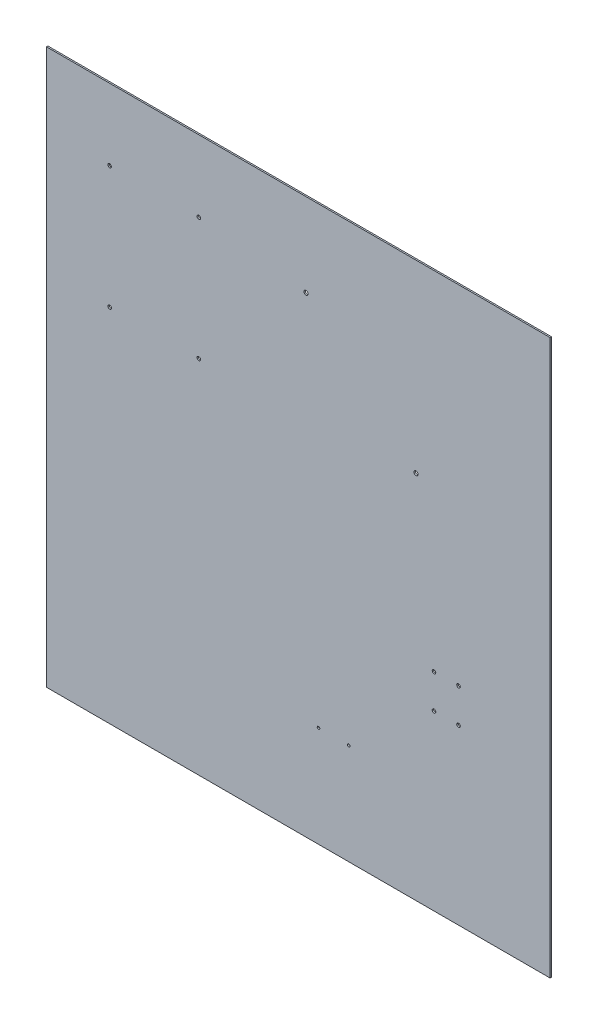
ISO-10303-21;
HEADER;
FILE_DESCRIPTION(('STEP AP214'),'2;1');
FILE_NAME('part.step','',(''),(''),'','','');
FILE_SCHEMA(('AUTOMOTIVE_DESIGN { 1 0 10303 214 1 1 1 1 }'));
ENDSEC;
DATA;
#1=APPLICATION_CONTEXT('core data for automotive mechanical design processes');
#2=APPLICATION_PROTOCOL_DEFINITION('international standard','automotive_design',2000,#1);
#3=PRODUCT_CONTEXT('',#1,'mechanical');
#4=PRODUCT('Part','Part','',(#3));
#5=PRODUCT_RELATED_PRODUCT_CATEGORY('part','',(#4));
#6=PRODUCT_DEFINITION_FORMATION('','',#4);
#7=PRODUCT_DEFINITION_CONTEXT('part definition',#1,'design');
#8=PRODUCT_DEFINITION('design','',#6,#7);
#9=PRODUCT_DEFINITION_SHAPE('','',#8);
#10=(LENGTH_UNIT() NAMED_UNIT(*) SI_UNIT(.MILLI.,.METRE.));
#11=(NAMED_UNIT(*) PLANE_ANGLE_UNIT() SI_UNIT($,.RADIAN.));
#12=(NAMED_UNIT(*) SI_UNIT($,.STERADIAN.) SOLID_ANGLE_UNIT());
#13=UNCERTAINTY_MEASURE_WITH_UNIT(LENGTH_MEASURE(1.E-05),#10,'distance_accuracy_value','');
#14=(GEOMETRIC_REPRESENTATION_CONTEXT(3) GLOBAL_UNCERTAINTY_ASSIGNED_CONTEXT((#13)) GLOBAL_UNIT_ASSIGNED_CONTEXT((#10,
#11,#12)) REPRESENTATION_CONTEXT('',''));
#15=CARTESIAN_POINT('',(0.,0.,0.));
#16=DIRECTION('',(0.,0.,1.));
#17=DIRECTION('',(1.,0.,0.));
#18=AXIS2_PLACEMENT_3D('',#15,#16,#17);
#19=CARTESIAN_POINT('',(-62.5393547899465,35.207252475344,1.2));
#20=DIRECTION('',(1.,0.,0.));
#21=DIRECTION('',(0.,1.,0.));
#22=AXIS2_PLACEMENT_3D('',#19,#20,#21);
#23=PLANE('',#22);
#24=DIRECTION('',(0.,-1.,0.));
#25=VECTOR('',#24,1.);
#26=CARTESIAN_POINT('',(-62.5393547899465,35.207252475344,0.));
#27=LINE('',#26,#25);
#28=CARTESIAN_POINT('',(-62.5393547899465,35.207252475344,0.));
#29=VERTEX_POINT('',#28);
#30=CARTESIAN_POINT('',(-62.5393547899464,-430.792747524656,0.));
#31=VERTEX_POINT('',#30);
#32=EDGE_CURVE('E96',#29,#31,#27,.T.);
#33=ORIENTED_EDGE('',*,*,#32,.T.);
#34=DIRECTION('',(0.,0.,-1.));
#35=VECTOR('',#34,1.);
#36=CARTESIAN_POINT('',(-62.5393547899464,-430.792747524656,1.2));
#37=LINE('',#36,#35);
#38=CARTESIAN_POINT('',(-62.5393547899464,-430.792747524656,1.2));
#39=VERTEX_POINT('',#38);
#40=EDGE_CURVE('E11',#39,#31,#37,.T.);
#41=ORIENTED_EDGE('',*,*,#40,.F.);
#42=DIRECTION('',(0.,-1.,0.));
#43=VECTOR('',#42,1.);
#44=CARTESIAN_POINT('',(-62.5393547899465,35.207252475344,1.2));
#45=LINE('',#44,#43);
#46=CARTESIAN_POINT('',(-62.5393547899465,35.207252475344,1.2));
#47=VERTEX_POINT('',#46);
#48=EDGE_CURVE('E84',#47,#39,#45,.T.);
#49=ORIENTED_EDGE('',*,*,#48,.F.);
#50=DIRECTION('',(0.,0.,-1.));
#51=VECTOR('',#50,1.);
#52=CARTESIAN_POINT('',(-62.5393547899465,35.207252475344,1.2));
#53=LINE('',#52,#51);
#54=EDGE_CURVE('E92',#47,#29,#53,.T.);
#55=ORIENTED_EDGE('',*,*,#54,.T.);
#56=EDGE_LOOP('',(#33,#41,#49,#55));
#57=FACE_BOUND('',#56,.T.);
#58=ADVANCED_FACE('F33',(#57),#23,.F.);
#59=CARTESIAN_POINT('',(-62.5393547899464,-430.792747524656,1.2));
#60=DIRECTION('',(0.,1.,0.));
#61=DIRECTION('',(0.,0.,1.));
#62=AXIS2_PLACEMENT_3D('',#59,#60,#61);
#63=PLANE('',#62);
#64=DIRECTION('',(1.,0.,0.));
#65=VECTOR('',#64,1.);
#66=CARTESIAN_POINT('',(-62.5393547899464,-430.792747524656,0.));
#67=LINE('',#66,#65);
#68=CARTESIAN_POINT('',(360.460645210054,-430.792747524656,0.));
#69=VERTEX_POINT('',#68);
#70=EDGE_CURVE('E88',#31,#69,#67,.T.);
#71=ORIENTED_EDGE('',*,*,#70,.T.);
#72=DIRECTION('',(0.,0.,-1.));
#73=VECTOR('',#72,1.);
#74=CARTESIAN_POINT('',(360.460645210054,-430.792747524656,1.2));
#75=LINE('',#74,#73);
#76=CARTESIAN_POINT('',(360.460645210054,-430.792747524656,1.2));
#77=VERTEX_POINT('',#76);
#78=EDGE_CURVE('E41',#77,#69,#75,.T.);
#79=ORIENTED_EDGE('',*,*,#78,.F.);
#80=DIRECTION('',(1.,0.,0.));
#81=VECTOR('',#80,1.);
#82=CARTESIAN_POINT('',(-62.5393547899464,-430.792747524656,1.2));
#83=LINE('',#82,#81);
#84=EDGE_CURVE('E79',#39,#77,#83,.T.);
#85=ORIENTED_EDGE('',*,*,#84,.F.);
#86=ORIENTED_EDGE('',*,*,#40,.T.);
#87=EDGE_LOOP('',(#71,#79,#85,#86));
#88=FACE_BOUND('',#87,.T.);
#89=ADVANCED_FACE('F87',(#88),#63,.F.);
#90=CARTESIAN_POINT('',(360.460645210053,35.207252475344,1.2));
#91=DIRECTION('',(-1.,0.,0.));
#92=DIRECTION('',(0.,-1.,0.));
#93=AXIS2_PLACEMENT_3D('',#90,#91,#92);
#94=PLANE('',#93);
#95=DIRECTION('',(0.,1.,0.));
#96=VECTOR('',#95,1.);
#97=CARTESIAN_POINT('',(360.460645210053,35.207252475344,0.));
#98=LINE('',#97,#96);
#99=CARTESIAN_POINT('',(360.460645210053,35.207252475344,0.));
#100=VERTEX_POINT('',#99);
#101=EDGE_CURVE('E66',#69,#100,#98,.T.);
#102=ORIENTED_EDGE('',*,*,#101,.T.);
#103=DIRECTION('',(0.,0.,-1.));
#104=VECTOR('',#103,1.);
#105=CARTESIAN_POINT('',(360.460645210053,35.207252475344,1.2));
#106=LINE('',#105,#104);
#107=CARTESIAN_POINT('',(360.460645210053,35.207252475344,1.2));
#108=VERTEX_POINT('',#107);
#109=EDGE_CURVE('E89',#108,#100,#106,.T.);
#110=ORIENTED_EDGE('',*,*,#109,.F.);
#111=DIRECTION('',(0.,1.,0.));
#112=VECTOR('',#111,1.);
#113=CARTESIAN_POINT('',(360.460645210053,35.207252475344,1.2));
#114=LINE('',#113,#112);
#115=EDGE_CURVE('E82',#77,#108,#114,.T.);
#116=ORIENTED_EDGE('',*,*,#115,.F.);
#117=ORIENTED_EDGE('',*,*,#78,.T.);
#118=EDGE_LOOP('',(#102,#110,#116,#117));
#119=FACE_BOUND('',#118,.T.);
#120=ADVANCED_FACE('F90',(#119),#94,.F.);
#121=CARTESIAN_POINT('',(-62.5393547899465,35.207252475344,1.2));
#122=DIRECTION('',(0.,-1.,0.));
#123=DIRECTION('',(0.,0.,-1.));
#124=AXIS2_PLACEMENT_3D('',#121,#122,#123);
#125=PLANE('',#124);
#126=DIRECTION('',(-1.,0.,0.));
#127=VECTOR('',#126,1.);
#128=CARTESIAN_POINT('',(-62.5393547899465,35.207252475344,0.));
#129=LINE('',#128,#127);
#130=EDGE_CURVE('E72',#100,#29,#129,.T.);
#131=ORIENTED_EDGE('',*,*,#130,.T.);
#132=ORIENTED_EDGE('',*,*,#54,.F.);
#133=DIRECTION('',(-1.,0.,0.));
#134=VECTOR('',#133,1.);
#135=CARTESIAN_POINT('',(-62.5393547899465,35.207252475344,1.2));
#136=LINE('',#135,#134);
#137=EDGE_CURVE('E49',#108,#47,#136,.T.);
#138=ORIENTED_EDGE('',*,*,#137,.F.);
#139=ORIENTED_EDGE('',*,*,#109,.T.);
#140=EDGE_LOOP('',(#131,#132,#138,#139));
#141=FACE_BOUND('',#140,.T.);
#142=ADVANCED_FACE('F104',(#141),#125,.F.);
#143=CARTESIAN_POINT('',(0.,0.,1.2));
#144=DIRECTION('',(0.,0.,1.));
#145=DIRECTION('',(1.,0.,0.));
#146=AXIS2_PLACEMENT_3D('',#143,#144,#145);
#147=PLANE('',#146);
#148=CARTESIAN_POINT('',(191.354341109446,-346.082111180294,1.2));
#149=DIRECTION('',(0.,0.,1.));
#150=DIRECTION('',(1.,0.,0.));
#151=AXIS2_PLACEMENT_3D('',#148,#149,#150);
#152=CIRCLE('',#151,1.09999999999999);
#153=CARTESIAN_POINT('',(192.454341109446,-346.082111180294,1.2));
#154=VERTEX_POINT('',#153);
#155=EDGE_CURVE('E176',#154,#154,#152,.T.);
#156=ORIENTED_EDGE('',*,*,#155,.F.);
#157=EDGE_LOOP('',(#156));
#158=FACE_BOUND('',#157,.T.);
#159=CARTESIAN_POINT('',(165.954341109446,-346.082111180294,1.2));
#160=DIRECTION('',(0.,0.,1.));
#161=DIRECTION('',(1.,0.,0.));
#162=AXIS2_PLACEMENT_3D('',#159,#160,#161);
#163=CIRCLE('',#162,1.09999999999999);
#164=CARTESIAN_POINT('',(167.054341109446,-346.082111180294,1.2));
#165=VERTEX_POINT('',#164);
#166=EDGE_CURVE('E170',#165,#165,#163,.T.);
#167=ORIENTED_EDGE('',*,*,#166,.F.);
#168=EDGE_LOOP('',(#167));
#169=FACE_BOUND('',#168,.T.);
#170=CARTESIAN_POINT('',(283.574763867652,-256.69728337756,1.2));
#171=DIRECTION('',(0.,0.,1.));
#172=DIRECTION('',(1.,0.,0.));
#173=AXIS2_PLACEMENT_3D('',#170,#171,#172);
#174=CIRCLE('',#173,1.50000000000002);
#175=CARTESIAN_POINT('',(285.074763867652,-256.69728337756,1.2));
#176=VERTEX_POINT('',#175);
#177=EDGE_CURVE('E164',#176,#176,#174,.T.);
#178=ORIENTED_EDGE('',*,*,#177,.F.);
#179=EDGE_LOOP('',(#178));
#180=FACE_BOUND('',#179,.T.);
#181=CARTESIAN_POINT('',(283.574763867652,-285.29728337756,1.2));
#182=DIRECTION('',(0.,0.,1.));
#183=DIRECTION('',(1.,0.,0.));
#184=AXIS2_PLACEMENT_3D('',#181,#182,#183);
#185=CIRCLE('',#184,1.50000000000002);
#186=CARTESIAN_POINT('',(285.074763867652,-285.29728337756,1.2));
#187=VERTEX_POINT('',#186);
#188=EDGE_CURVE('E158',#187,#187,#185,.T.);
#189=ORIENTED_EDGE('',*,*,#188,.F.);
#190=EDGE_LOOP('',(#189));
#191=FACE_BOUND('',#190,.T.);
#192=CARTESIAN_POINT('',(262.974763867652,-285.29728337756,1.2));
#193=DIRECTION('',(0.,0.,1.));
#194=DIRECTION('',(1.,0.,0.));
#195=AXIS2_PLACEMENT_3D('',#192,#193,#194);
#196=CIRCLE('',#195,1.50000000000002);
#197=CARTESIAN_POINT('',(264.474763867652,-285.29728337756,1.2));
#198=VERTEX_POINT('',#197);
#199=EDGE_CURVE('E152',#198,#198,#196,.T.);
#200=ORIENTED_EDGE('',*,*,#199,.F.);
#201=EDGE_LOOP('',(#200));
#202=FACE_BOUND('',#201,.T.);
#203=CARTESIAN_POINT('',(262.974763867652,-256.69728337756,1.2));
#204=DIRECTION('',(0.,0.,1.));
#205=DIRECTION('',(1.,0.,0.));
#206=AXIS2_PLACEMENT_3D('',#203,#204,#205);
#207=CIRCLE('',#206,1.50000000000002);
#208=CARTESIAN_POINT('',(264.474763867652,-256.69728337756,1.2));
#209=VERTEX_POINT('',#208);
#210=EDGE_CURVE('E146',#209,#209,#207,.T.);
#211=ORIENTED_EDGE('',*,*,#210,.F.);
#212=EDGE_LOOP('',(#211));
#213=FACE_BOUND('',#212,.T.);
#214=CARTESIAN_POINT('',(247.890645210054,-119.792747524656,1.2));
#215=DIRECTION('',(0.,0.,1.));
#216=DIRECTION('',(1.,0.,0.));
#217=AXIS2_PLACEMENT_3D('',#214,#215,#216);
#218=CIRCLE('',#217,1.75000000000001);
#219=CARTESIAN_POINT('',(249.640645210054,-119.792747524656,1.2));
#220=VERTEX_POINT('',#219);
#221=EDGE_CURVE('E140',#220,#220,#218,.T.);
#222=ORIENTED_EDGE('',*,*,#221,.F.);
#223=EDGE_LOOP('',(#222));
#224=FACE_BOUND('',#223,.T.);
#225=CARTESIAN_POINT('',(-9.5393547899454,-127.662747524656,1.2));
#226=DIRECTION('',(0.,0.,1.));
#227=DIRECTION('',(1.,0.,0.));
#228=AXIS2_PLACEMENT_3D('',#225,#226,#227);
#229=CIRCLE('',#228,1.5);
#230=CARTESIAN_POINT('',(-8.03935478994539,-127.662747524656,1.2));
#231=VERTEX_POINT('',#230);
#232=EDGE_CURVE('E134',#231,#231,#229,.T.);
#233=ORIENTED_EDGE('',*,*,#232,.F.);
#234=EDGE_LOOP('',(#233));
#235=FACE_BOUND('',#234,.T.);
#236=CARTESIAN_POINT('',(65.3906452100546,-127.662747524656,1.2));
#237=DIRECTION('',(0.,0.,1.));
#238=DIRECTION('',(1.,0.,0.));
#239=AXIS2_PLACEMENT_3D('',#236,#237,#238);
#240=CIRCLE('',#239,1.5);
#241=CARTESIAN_POINT('',(66.8906452100546,-127.662747524656,1.2));
#242=VERTEX_POINT('',#241);
#243=EDGE_CURVE('E128',#242,#242,#240,.T.);
#244=ORIENTED_EDGE('',*,*,#243,.F.);
#245=EDGE_LOOP('',(#244));
#246=FACE_BOUND('',#245,.T.);
#247=CARTESIAN_POINT('',(65.3906452100535,-24.792747524656,1.2));
#248=DIRECTION('',(0.,0.,1.));
#249=DIRECTION('',(1.,0.,0.));
#250=AXIS2_PLACEMENT_3D('',#247,#248,#249);
#251=CIRCLE('',#250,1.5);
#252=CARTESIAN_POINT('',(66.8906452100535,-24.792747524656,1.2));
#253=VERTEX_POINT('',#252);
#254=EDGE_CURVE('E122',#253,#253,#251,.T.);
#255=ORIENTED_EDGE('',*,*,#254,.F.);
#256=EDGE_LOOP('',(#255));
#257=FACE_BOUND('',#256,.T.);
#258=CARTESIAN_POINT('',(155.390645210054,-34.792747524656,1.2));
#259=DIRECTION('',(0.,0.,1.));
#260=DIRECTION('',(1.,0.,0.));
#261=AXIS2_PLACEMENT_3D('',#258,#259,#260);
#262=CIRCLE('',#261,1.75000000000001);
#263=CARTESIAN_POINT('',(157.140645210054,-34.792747524656,1.2));
#264=VERTEX_POINT('',#263);
#265=EDGE_CURVE('E116',#264,#264,#262,.T.);
#266=ORIENTED_EDGE('',*,*,#265,.F.);
#267=EDGE_LOOP('',(#266));
#268=FACE_BOUND('',#267,.T.);
#269=CARTESIAN_POINT('',(-9.53935478994648,-24.792747524656,1.2));
#270=DIRECTION('',(0.,0.,1.));
#271=DIRECTION('',(1.,0.,0.));
#272=AXIS2_PLACEMENT_3D('',#269,#270,#271);
#273=CIRCLE('',#272,1.5);
#274=CARTESIAN_POINT('',(-8.03935478994647,-24.792747524656,1.2));
#275=VERTEX_POINT('',#274);
#276=EDGE_CURVE('E110',#275,#275,#273,.T.);
#277=ORIENTED_EDGE('',*,*,#276,.F.);
#278=EDGE_LOOP('',(#277));
#279=FACE_BOUND('',#278,.T.);
#280=ORIENTED_EDGE('',*,*,#48,.T.);
#281=ORIENTED_EDGE('',*,*,#84,.T.);
#282=ORIENTED_EDGE('',*,*,#115,.T.);
#283=ORIENTED_EDGE('',*,*,#137,.T.);
#284=EDGE_LOOP('',(#280,#281,#282,#283));
#285=FACE_BOUND('',#284,.T.);
#286=ADVANCED_FACE('F80',(#158,#169,#180,#191,#202,#213,#224,#235,#246,#257,#268,#279,#285),
#147,.T.);
#287=CARTESIAN_POINT('',(0.,0.,0.));
#288=DIRECTION('',(0.,0.,1.));
#289=DIRECTION('',(1.,0.,0.));
#290=AXIS2_PLACEMENT_3D('',#287,#288,#289);
#291=PLANE('',#290);
#292=CARTESIAN_POINT('',(191.354341109446,-346.082111180294,0.));
#293=DIRECTION('',(0.,0.,1.));
#294=DIRECTION('',(1.,0.,0.));
#295=AXIS2_PLACEMENT_3D('',#292,#293,#294);
#296=CIRCLE('',#295,1.09999999999999);
#297=CARTESIAN_POINT('',(192.454341109446,-346.082111180294,0.));
#298=VERTEX_POINT('',#297);
#299=EDGE_CURVE('E173',#298,#298,#296,.T.);
#300=ORIENTED_EDGE('',*,*,#299,.T.);
#301=EDGE_LOOP('',(#300));
#302=FACE_BOUND('',#301,.T.);
#303=CARTESIAN_POINT('',(165.954341109446,-346.082111180294,0.));
#304=DIRECTION('',(0.,0.,1.));
#305=DIRECTION('',(1.,0.,0.));
#306=AXIS2_PLACEMENT_3D('',#303,#304,#305);
#307=CIRCLE('',#306,1.09999999999999);
#308=CARTESIAN_POINT('',(167.054341109446,-346.082111180294,0.));
#309=VERTEX_POINT('',#308);
#310=EDGE_CURVE('E167',#309,#309,#307,.T.);
#311=ORIENTED_EDGE('',*,*,#310,.T.);
#312=EDGE_LOOP('',(#311));
#313=FACE_BOUND('',#312,.T.);
#314=CARTESIAN_POINT('',(283.574763867652,-256.69728337756,0.));
#315=DIRECTION('',(0.,0.,1.));
#316=DIRECTION('',(1.,0.,0.));
#317=AXIS2_PLACEMENT_3D('',#314,#315,#316);
#318=CIRCLE('',#317,1.50000000000002);
#319=CARTESIAN_POINT('',(285.074763867652,-256.69728337756,0.));
#320=VERTEX_POINT('',#319);
#321=EDGE_CURVE('E161',#320,#320,#318,.T.);
#322=ORIENTED_EDGE('',*,*,#321,.T.);
#323=EDGE_LOOP('',(#322));
#324=FACE_BOUND('',#323,.T.);
#325=CARTESIAN_POINT('',(283.574763867652,-285.29728337756,0.));
#326=DIRECTION('',(0.,0.,1.));
#327=DIRECTION('',(1.,0.,0.));
#328=AXIS2_PLACEMENT_3D('',#325,#326,#327);
#329=CIRCLE('',#328,1.50000000000002);
#330=CARTESIAN_POINT('',(285.074763867652,-285.29728337756,0.));
#331=VERTEX_POINT('',#330);
#332=EDGE_CURVE('E155',#331,#331,#329,.T.);
#333=ORIENTED_EDGE('',*,*,#332,.T.);
#334=EDGE_LOOP('',(#333));
#335=FACE_BOUND('',#334,.T.);
#336=CARTESIAN_POINT('',(262.974763867652,-285.29728337756,0.));
#337=DIRECTION('',(0.,0.,1.));
#338=DIRECTION('',(1.,0.,0.));
#339=AXIS2_PLACEMENT_3D('',#336,#337,#338);
#340=CIRCLE('',#339,1.50000000000002);
#341=CARTESIAN_POINT('',(264.474763867652,-285.29728337756,0.));
#342=VERTEX_POINT('',#341);
#343=EDGE_CURVE('E149',#342,#342,#340,.T.);
#344=ORIENTED_EDGE('',*,*,#343,.T.);
#345=EDGE_LOOP('',(#344));
#346=FACE_BOUND('',#345,.T.);
#347=CARTESIAN_POINT('',(262.974763867652,-256.69728337756,0.));
#348=DIRECTION('',(0.,0.,1.));
#349=DIRECTION('',(1.,0.,0.));
#350=AXIS2_PLACEMENT_3D('',#347,#348,#349);
#351=CIRCLE('',#350,1.50000000000002);
#352=CARTESIAN_POINT('',(264.474763867652,-256.69728337756,0.));
#353=VERTEX_POINT('',#352);
#354=EDGE_CURVE('E143',#353,#353,#351,.T.);
#355=ORIENTED_EDGE('',*,*,#354,.T.);
#356=EDGE_LOOP('',(#355));
#357=FACE_BOUND('',#356,.T.);
#358=CARTESIAN_POINT('',(247.890645210054,-119.792747524656,0.));
#359=DIRECTION('',(0.,0.,1.));
#360=DIRECTION('',(1.,0.,0.));
#361=AXIS2_PLACEMENT_3D('',#358,#359,#360);
#362=CIRCLE('',#361,1.75000000000001);
#363=CARTESIAN_POINT('',(249.640645210054,-119.792747524656,0.));
#364=VERTEX_POINT('',#363);
#365=EDGE_CURVE('E137',#364,#364,#362,.T.);
#366=ORIENTED_EDGE('',*,*,#365,.T.);
#367=EDGE_LOOP('',(#366));
#368=FACE_BOUND('',#367,.T.);
#369=CARTESIAN_POINT('',(-9.5393547899454,-127.662747524656,0.));
#370=DIRECTION('',(0.,0.,1.));
#371=DIRECTION('',(1.,0.,0.));
#372=AXIS2_PLACEMENT_3D('',#369,#370,#371);
#373=CIRCLE('',#372,1.5);
#374=CARTESIAN_POINT('',(-8.03935478994539,-127.662747524656,0.));
#375=VERTEX_POINT('',#374);
#376=EDGE_CURVE('E131',#375,#375,#373,.T.);
#377=ORIENTED_EDGE('',*,*,#376,.T.);
#378=EDGE_LOOP('',(#377));
#379=FACE_BOUND('',#378,.T.);
#380=CARTESIAN_POINT('',(65.3906452100546,-127.662747524656,0.));
#381=DIRECTION('',(0.,0.,1.));
#382=DIRECTION('',(1.,0.,0.));
#383=AXIS2_PLACEMENT_3D('',#380,#381,#382);
#384=CIRCLE('',#383,1.5);
#385=CARTESIAN_POINT('',(66.8906452100546,-127.662747524656,0.));
#386=VERTEX_POINT('',#385);
#387=EDGE_CURVE('E125',#386,#386,#384,.T.);
#388=ORIENTED_EDGE('',*,*,#387,.T.);
#389=EDGE_LOOP('',(#388));
#390=FACE_BOUND('',#389,.T.);
#391=CARTESIAN_POINT('',(65.3906452100535,-24.792747524656,0.));
#392=DIRECTION('',(0.,0.,1.));
#393=DIRECTION('',(1.,0.,0.));
#394=AXIS2_PLACEMENT_3D('',#391,#392,#393);
#395=CIRCLE('',#394,1.5);
#396=CARTESIAN_POINT('',(66.8906452100535,-24.792747524656,0.));
#397=VERTEX_POINT('',#396);
#398=EDGE_CURVE('E119',#397,#397,#395,.T.);
#399=ORIENTED_EDGE('',*,*,#398,.T.);
#400=EDGE_LOOP('',(#399));
#401=FACE_BOUND('',#400,.T.);
#402=CARTESIAN_POINT('',(155.390645210054,-34.792747524656,0.));
#403=DIRECTION('',(0.,0.,1.));
#404=DIRECTION('',(1.,0.,0.));
#405=AXIS2_PLACEMENT_3D('',#402,#403,#404);
#406=CIRCLE('',#405,1.75000000000001);
#407=CARTESIAN_POINT('',(157.140645210054,-34.792747524656,0.));
#408=VERTEX_POINT('',#407);
#409=EDGE_CURVE('E113',#408,#408,#406,.T.);
#410=ORIENTED_EDGE('',*,*,#409,.T.);
#411=EDGE_LOOP('',(#410));
#412=FACE_BOUND('',#411,.T.);
#413=CARTESIAN_POINT('',(-9.53935478994648,-24.792747524656,0.));
#414=DIRECTION('',(0.,0.,1.));
#415=DIRECTION('',(1.,0.,0.));
#416=AXIS2_PLACEMENT_3D('',#413,#414,#415);
#417=CIRCLE('',#416,1.5);
#418=CARTESIAN_POINT('',(-8.03935478994647,-24.792747524656,0.));
#419=VERTEX_POINT('',#418);
#420=EDGE_CURVE('E99',#419,#419,#417,.T.);
#421=ORIENTED_EDGE('',*,*,#420,.T.);
#422=EDGE_LOOP('',(#421));
#423=FACE_BOUND('',#422,.T.);
#424=ORIENTED_EDGE('',*,*,#32,.F.);
#425=ORIENTED_EDGE('',*,*,#130,.F.);
#426=ORIENTED_EDGE('',*,*,#101,.F.);
#427=ORIENTED_EDGE('',*,*,#70,.F.);
#428=EDGE_LOOP('',(#424,#425,#426,#427));
#429=FACE_BOUND('',#428,.T.);
#430=ADVANCED_FACE('F107',(#302,#313,#324,#335,#346,#357,#368,#379,#390,#401,#412,#423,#429),
#291,.F.);
#431=CARTESIAN_POINT('',(-9.53935478994648,-24.792747524656,0.));
#432=DIRECTION('',(0.,0.,1.));
#433=DIRECTION('',(1.,0.,0.));
#434=AXIS2_PLACEMENT_3D('',#431,#432,#433);
#435=CYLINDRICAL_SURFACE('',#434,1.5);
#436=ORIENTED_EDGE('',*,*,#420,.F.);
#437=EDGE_LOOP('',(#436));
#438=FACE_BOUND('',#437,.T.);
#439=ORIENTED_EDGE('',*,*,#276,.T.);
#440=EDGE_LOOP('',(#439));
#441=FACE_BOUND('',#440,.T.);
#442=ADVANCED_FACE('F216',(#438,#441),#435,.F.);
#443=CARTESIAN_POINT('',(155.390645210054,-34.792747524656,0.));
#444=DIRECTION('',(0.,0.,1.));
#445=DIRECTION('',(1.,0.,0.));
#446=AXIS2_PLACEMENT_3D('',#443,#444,#445);
#447=CYLINDRICAL_SURFACE('',#446,1.75000000000001);
#448=ORIENTED_EDGE('',*,*,#409,.F.);
#449=EDGE_LOOP('',(#448));
#450=FACE_BOUND('',#449,.T.);
#451=ORIENTED_EDGE('',*,*,#265,.T.);
#452=EDGE_LOOP('',(#451));
#453=FACE_BOUND('',#452,.T.);
#454=ADVANCED_FACE('F218',(#450,#453),#447,.F.);
#455=CARTESIAN_POINT('',(65.3906452100535,-24.792747524656,0.));
#456=DIRECTION('',(0.,0.,1.));
#457=DIRECTION('',(1.,0.,0.));
#458=AXIS2_PLACEMENT_3D('',#455,#456,#457);
#459=CYLINDRICAL_SURFACE('',#458,1.5);
#460=ORIENTED_EDGE('',*,*,#398,.F.);
#461=EDGE_LOOP('',(#460));
#462=FACE_BOUND('',#461,.T.);
#463=ORIENTED_EDGE('',*,*,#254,.T.);
#464=EDGE_LOOP('',(#463));
#465=FACE_BOUND('',#464,.T.);
#466=ADVANCED_FACE('F225',(#462,#465),#459,.F.);
#467=CARTESIAN_POINT('',(65.3906452100546,-127.662747524656,0.));
#468=DIRECTION('',(0.,0.,1.));
#469=DIRECTION('',(1.,0.,0.));
#470=AXIS2_PLACEMENT_3D('',#467,#468,#469);
#471=CYLINDRICAL_SURFACE('',#470,1.5);
#472=ORIENTED_EDGE('',*,*,#387,.F.);
#473=EDGE_LOOP('',(#472));
#474=FACE_BOUND('',#473,.T.);
#475=ORIENTED_EDGE('',*,*,#243,.T.);
#476=EDGE_LOOP('',(#475));
#477=FACE_BOUND('',#476,.T.);
#478=ADVANCED_FACE('F273',(#474,#477),#471,.F.);
#479=CARTESIAN_POINT('',(-9.5393547899454,-127.662747524656,0.));
#480=DIRECTION('',(0.,0.,1.));
#481=DIRECTION('',(1.,0.,0.));
#482=AXIS2_PLACEMENT_3D('',#479,#480,#481);
#483=CYLINDRICAL_SURFACE('',#482,1.5);
#484=ORIENTED_EDGE('',*,*,#376,.F.);
#485=EDGE_LOOP('',(#484));
#486=FACE_BOUND('',#485,.T.);
#487=ORIENTED_EDGE('',*,*,#232,.T.);
#488=EDGE_LOOP('',(#487));
#489=FACE_BOUND('',#488,.T.);
#490=ADVANCED_FACE('F283',(#486,#489),#483,.F.);
#491=CARTESIAN_POINT('',(247.890645210054,-119.792747524656,0.));
#492=DIRECTION('',(0.,0.,1.));
#493=DIRECTION('',(1.,0.,0.));
#494=AXIS2_PLACEMENT_3D('',#491,#492,#493);
#495=CYLINDRICAL_SURFACE('',#494,1.75000000000001);
#496=ORIENTED_EDGE('',*,*,#365,.F.);
#497=EDGE_LOOP('',(#496));
#498=FACE_BOUND('',#497,.T.);
#499=ORIENTED_EDGE('',*,*,#221,.T.);
#500=EDGE_LOOP('',(#499));
#501=FACE_BOUND('',#500,.T.);
#502=ADVANCED_FACE('F293',(#498,#501),#495,.F.);
#503=CARTESIAN_POINT('',(262.974763867652,-256.69728337756,0.));
#504=DIRECTION('',(0.,0.,1.));
#505=DIRECTION('',(1.,0.,0.));
#506=AXIS2_PLACEMENT_3D('',#503,#504,#505);
#507=CYLINDRICAL_SURFACE('',#506,1.50000000000002);
#508=ORIENTED_EDGE('',*,*,#354,.F.);
#509=EDGE_LOOP('',(#508));
#510=FACE_BOUND('',#509,.T.);
#511=ORIENTED_EDGE('',*,*,#210,.T.);
#512=EDGE_LOOP('',(#511));
#513=FACE_BOUND('',#512,.T.);
#514=ADVANCED_FACE('F303',(#510,#513),#507,.F.);
#515=CARTESIAN_POINT('',(262.974763867652,-285.29728337756,0.));
#516=DIRECTION('',(0.,0.,1.));
#517=DIRECTION('',(1.,0.,0.));
#518=AXIS2_PLACEMENT_3D('',#515,#516,#517);
#519=CYLINDRICAL_SURFACE('',#518,1.50000000000002);
#520=ORIENTED_EDGE('',*,*,#343,.F.);
#521=EDGE_LOOP('',(#520));
#522=FACE_BOUND('',#521,.T.);
#523=ORIENTED_EDGE('',*,*,#199,.T.);
#524=EDGE_LOOP('',(#523));
#525=FACE_BOUND('',#524,.T.);
#526=ADVANCED_FACE('F313',(#522,#525),#519,.F.);
#527=CARTESIAN_POINT('',(283.574763867652,-285.29728337756,0.));
#528=DIRECTION('',(0.,0.,1.));
#529=DIRECTION('',(1.,0.,0.));
#530=AXIS2_PLACEMENT_3D('',#527,#528,#529);
#531=CYLINDRICAL_SURFACE('',#530,1.50000000000002);
#532=ORIENTED_EDGE('',*,*,#332,.F.);
#533=EDGE_LOOP('',(#532));
#534=FACE_BOUND('',#533,.T.);
#535=ORIENTED_EDGE('',*,*,#188,.T.);
#536=EDGE_LOOP('',(#535));
#537=FACE_BOUND('',#536,.T.);
#538=ADVANCED_FACE('F323',(#534,#537),#531,.F.);
#539=CARTESIAN_POINT('',(283.574763867652,-256.69728337756,0.));
#540=DIRECTION('',(0.,0.,1.));
#541=DIRECTION('',(1.,0.,0.));
#542=AXIS2_PLACEMENT_3D('',#539,#540,#541);
#543=CYLINDRICAL_SURFACE('',#542,1.50000000000002);
#544=ORIENTED_EDGE('',*,*,#321,.F.);
#545=EDGE_LOOP('',(#544));
#546=FACE_BOUND('',#545,.T.);
#547=ORIENTED_EDGE('',*,*,#177,.T.);
#548=EDGE_LOOP('',(#547));
#549=FACE_BOUND('',#548,.T.);
#550=ADVANCED_FACE('F333',(#546,#549),#543,.F.);
#551=CARTESIAN_POINT('',(165.954341109446,-346.082111180294,0.));
#552=DIRECTION('',(0.,0.,1.));
#553=DIRECTION('',(1.,0.,0.));
#554=AXIS2_PLACEMENT_3D('',#551,#552,#553);
#555=CYLINDRICAL_SURFACE('',#554,1.09999999999999);
#556=ORIENTED_EDGE('',*,*,#310,.F.);
#557=EDGE_LOOP('',(#556));
#558=FACE_BOUND('',#557,.T.);
#559=ORIENTED_EDGE('',*,*,#166,.T.);
#560=EDGE_LOOP('',(#559));
#561=FACE_BOUND('',#560,.T.);
#562=ADVANCED_FACE('F187',(#558,#561),#555,.F.);
#563=CARTESIAN_POINT('',(191.354341109446,-346.082111180294,0.));
#564=DIRECTION('',(0.,0.,1.));
#565=DIRECTION('',(1.,0.,0.));
#566=AXIS2_PLACEMENT_3D('',#563,#564,#565);
#567=CYLINDRICAL_SURFACE('',#566,1.09999999999999);
#568=ORIENTED_EDGE('',*,*,#299,.F.);
#569=EDGE_LOOP('',(#568));
#570=FACE_BOUND('',#569,.T.);
#571=ORIENTED_EDGE('',*,*,#155,.T.);
#572=EDGE_LOOP('',(#571));
#573=FACE_BOUND('',#572,.T.);
#574=ADVANCED_FACE('F184',(#570,#573),#567,.F.);
#575=CLOSED_SHELL('',(#58,#89,#120,#142,#286,#430,#442,#454,#466,#478,#490,#502,#514,#526,#538,
#550,#562,#574));
#576=MANIFOLD_SOLID_BREP('B2',#575);
#577=ADVANCED_BREP_SHAPE_REPRESENTATION('',(#18,#576),#14);
#578=SHAPE_DEFINITION_REPRESENTATION(#9,#577);
ENDSEC;
END-ISO-10303-21;
